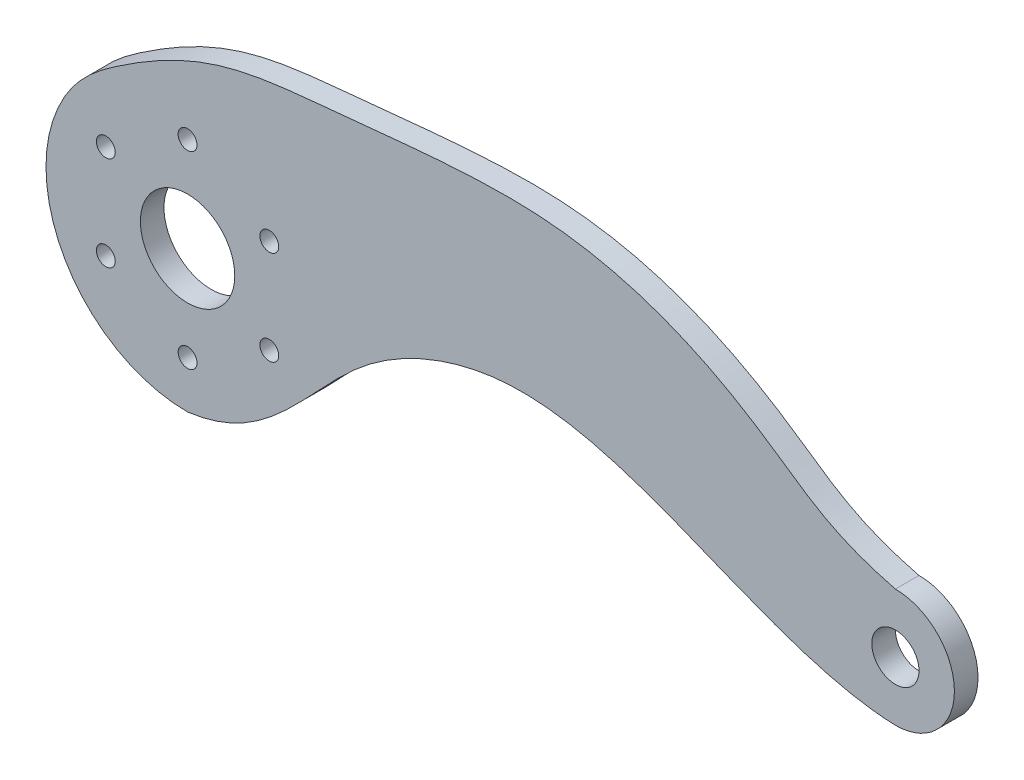
ISO-10303-21;
HEADER;
FILE_DESCRIPTION(('STEP AP214'),'2;1');
FILE_NAME('part.step','',(''),(''),'','','');
FILE_SCHEMA(('AUTOMOTIVE_DESIGN { 1 0 10303 214 1 1 1 1 }'));
ENDSEC;
DATA;
#1=APPLICATION_CONTEXT('core data for automotive mechanical design processes');
#2=APPLICATION_PROTOCOL_DEFINITION('international standard','automotive_design',2000,#1);
#3=PRODUCT_CONTEXT('',#1,'mechanical');
#4=PRODUCT('Part','Part','',(#3));
#5=PRODUCT_RELATED_PRODUCT_CATEGORY('part','',(#4));
#6=PRODUCT_DEFINITION_FORMATION('','',#4);
#7=PRODUCT_DEFINITION_CONTEXT('part definition',#1,'design');
#8=PRODUCT_DEFINITION('design','',#6,#7);
#9=PRODUCT_DEFINITION_SHAPE('','',#8);
#10=(LENGTH_UNIT() NAMED_UNIT(*) SI_UNIT(.MILLI.,.METRE.));
#11=(NAMED_UNIT(*) PLANE_ANGLE_UNIT() SI_UNIT($,.RADIAN.));
#12=(NAMED_UNIT(*) SI_UNIT($,.STERADIAN.) SOLID_ANGLE_UNIT());
#13=UNCERTAINTY_MEASURE_WITH_UNIT(LENGTH_MEASURE(1.E-05),#10,'distance_accuracy_value','');
#14=(GEOMETRIC_REPRESENTATION_CONTEXT(3) GLOBAL_UNCERTAINTY_ASSIGNED_CONTEXT((#13)) GLOBAL_UNIT_ASSIGNED_CONTEXT((#10,
#11,#12)) REPRESENTATION_CONTEXT('',''));
#15=CARTESIAN_POINT('',(0.,0.,0.));
#16=DIRECTION('',(0.,0.,1.));
#17=DIRECTION('',(1.,0.,0.));
#18=AXIS2_PLACEMENT_3D('',#15,#16,#17);
#19=CARTESIAN_POINT('',(150.,0.,5.));
#20=DIRECTION('',(0.,0.,-1.));
#21=DIRECTION('',(-1.,0.,0.));
#22=AXIS2_PLACEMENT_3D('',#19,#20,#21);
#23=CYLINDRICAL_SURFACE('',#22,12.5);
#24=CARTESIAN_POINT('',(150.,0.,0.));
#25=DIRECTION('',(0.,0.,1.));
#26=DIRECTION('',(1.,0.,0.));
#27=AXIS2_PLACEMENT_3D('',#24,#25,#26);
#28=CIRCLE('',#27,12.5);
#29=CARTESIAN_POINT('',(159.428456141883,-8.2069613609783,0.));
#30=VERTEX_POINT('',#29);
#31=CARTESIAN_POINT('',(150.,12.5,0.));
#32=VERTEX_POINT('',#31);
#33=EDGE_CURVE('E174',#30,#32,#28,.T.);
#34=ORIENTED_EDGE('',*,*,#33,.T.);
#35=DIRECTION('',(0.,0.,-1.));
#36=VECTOR('',#35,1.);
#37=CARTESIAN_POINT('',(150.,12.5,5.));
#38=LINE('',#37,#36);
#39=CARTESIAN_POINT('',(150.,12.5,5.));
#40=VERTEX_POINT('',#39);
#41=EDGE_CURVE('E11',#40,#32,#38,.T.);
#42=ORIENTED_EDGE('',*,*,#41,.F.);
#43=CARTESIAN_POINT('',(150.,0.,5.));
#44=DIRECTION('',(0.,0.,1.));
#45=DIRECTION('',(1.,0.,0.));
#46=AXIS2_PLACEMENT_3D('',#43,#44,#45);
#47=CIRCLE('',#46,12.5);
#48=CARTESIAN_POINT('',(159.428456141883,-8.2069613609783,5.));
#49=VERTEX_POINT('',#48);
#50=EDGE_CURVE('E90',#49,#40,#47,.T.);
#51=ORIENTED_EDGE('',*,*,#50,.F.);
#52=DIRECTION('',(0.,0.,-1.));
#53=VECTOR('',#52,1.);
#54=CARTESIAN_POINT('',(159.428456141883,-8.2069613609783,5.));
#55=LINE('',#54,#53);
#56=EDGE_CURVE('E155',#49,#30,#55,.T.);
#57=ORIENTED_EDGE('',*,*,#56,.T.);
#58=EDGE_LOOP('',(#34,#42,#51,#57));
#59=FACE_BOUND('',#58,.T.);
#60=ADVANCED_FACE('F39',(#59),#23,.T.);
#61=CARTESIAN_POINT('',(-26.0634616612886,14.8558394656963,5.));
#62=CARTESIAN_POINT('',(-22.9952074946197,20.2388624193786,5.));
#63=CARTESIAN_POINT('',(2.37328640151584,39.108047074936,5.));
#64=CARTESIAN_POINT('',(20.1597515349127,39.1077374338959,5.));
#65=CARTESIAN_POINT('',(86.7416157626449,46.9998153067509,5.));
#66=CARTESIAN_POINT('',(125.812924925436,25.830072721874,5.));
#67=CARTESIAN_POINT('',(135.882657692138,16.0754827587227,5.));
#68=CARTESIAN_POINT('',(150.,12.5,5.));
#69=B_SPLINE_CURVE_WITH_KNOTS('',3,(#61,#62,#63,#64,#65,#66,#67,#68),.UNSPECIFIED.,.F.,.F.,(4,1,
1,1,1,4),(0.,0.056043778506057,0.324796612619319,0.474987683898155,0.725167046493458,
0.945335070860267),.UNSPECIFIED.);
#70=DIRECTION('',(0.,0.,-1.));
#71=VECTOR('',#70,1.);
#72=SURFACE_OF_LINEAR_EXTRUSION('',#69,#71);
#73=CARTESIAN_POINT('',(-26.0634616612886,14.8558394656963,0.));
#74=CARTESIAN_POINT('',(-22.9952074946197,20.2388624193786,0.));
#75=CARTESIAN_POINT('',(2.37328640151584,39.108047074936,0.));
#76=CARTESIAN_POINT('',(20.1597515349127,39.1077374338959,0.));
#77=CARTESIAN_POINT('',(86.7416157626449,46.9998153067509,0.));
#78=CARTESIAN_POINT('',(125.812924925436,25.830072721874,0.));
#79=CARTESIAN_POINT('',(135.882657692138,16.0754827587227,0.));
#80=CARTESIAN_POINT('',(150.,12.5,0.));
#81=B_SPLINE_CURVE_WITH_KNOTS('',3,(#73,#74,#75,#76,#77,#78,#79,#80),.UNSPECIFIED.,.F.,.F.,(4,1,
1,1,1,4),(0.,0.056043778506057,0.324796612619319,0.474987683898155,0.725167046493458,
0.945335070860267),.UNSPECIFIED.);
#82=CARTESIAN_POINT('',(-26.0634616612886,14.8558394656963,0.));
#83=VERTEX_POINT('',#82);
#84=EDGE_CURVE('E170',#83,#32,#81,.T.);
#85=ORIENTED_EDGE('',*,*,#84,.F.);
#86=DIRECTION('',(0.,0.,-1.));
#87=VECTOR('',#86,1.);
#88=CARTESIAN_POINT('',(-26.0634616612886,14.8558394656963,5.));
#89=LINE('',#88,#87);
#90=CARTESIAN_POINT('',(-26.0634616612886,14.8558394656963,5.));
#91=VERTEX_POINT('',#90);
#92=EDGE_CURVE('E48',#91,#83,#89,.T.);
#93=ORIENTED_EDGE('',*,*,#92,.F.);
#94=EDGE_CURVE('E124',#91,#40,#69,.T.);
#95=ORIENTED_EDGE('',*,*,#94,.T.);
#96=ORIENTED_EDGE('',*,*,#41,.T.);
#97=EDGE_LOOP('',(#85,#93,#95,#96));
#98=FACE_BOUND('',#97,.T.);
#99=ADVANCED_FACE('F172',(#98),#72,.T.);
#100=CARTESIAN_POINT('',(0.,0.,5.));
#101=DIRECTION('',(0.,0.,-1.));
#102=DIRECTION('',(-1.,0.,0.));
#103=AXIS2_PLACEMENT_3D('',#100,#101,#102);
#104=CYLINDRICAL_SURFACE('',#103,30.);
#105=CARTESIAN_POINT('',(0.,0.,0.));
#106=DIRECTION('',(0.,0.,1.));
#107=DIRECTION('',(1.,0.,0.));
#108=AXIS2_PLACEMENT_3D('',#105,#106,#107);
#109=CIRCLE('',#108,30.);
#110=CARTESIAN_POINT('',(0.,-30.,0.));
#111=VERTEX_POINT('',#110);
#112=EDGE_CURVE('E162',#83,#111,#109,.T.);
#113=ORIENTED_EDGE('',*,*,#112,.T.);
#114=DIRECTION('',(0.,0.,-1.));
#115=VECTOR('',#114,1.);
#116=CARTESIAN_POINT('',(0.,-30.,5.));
#117=LINE('',#116,#115);
#118=CARTESIAN_POINT('',(0.,-30.,5.));
#119=VERTEX_POINT('',#118);
#120=EDGE_CURVE('E115',#119,#111,#117,.T.);
#121=ORIENTED_EDGE('',*,*,#120,.F.);
#122=CARTESIAN_POINT('',(0.,0.,5.));
#123=DIRECTION('',(0.,0.,1.));
#124=DIRECTION('',(1.,0.,0.));
#125=AXIS2_PLACEMENT_3D('',#122,#123,#124);
#126=CIRCLE('',#125,30.);
#127=EDGE_CURVE('E106',#91,#119,#126,.T.);
#128=ORIENTED_EDGE('',*,*,#127,.F.);
#129=ORIENTED_EDGE('',*,*,#92,.T.);
#130=EDGE_LOOP('',(#113,#121,#128,#129));
#131=FACE_BOUND('',#130,.T.);
#132=ADVANCED_FACE('F161',(#131),#104,.T.);
#133=CARTESIAN_POINT('',(0.,-30.,5.));
#134=CARTESIAN_POINT('',(17.9367533899456,-27.7458951634713,5.));
#135=CARTESIAN_POINT('',(30.1701670762407,-2.35203179127826,5.));
#136=CARTESIAN_POINT('',(85.2158700652859,19.6119948147056,5.));
#137=CARTESIAN_POINT('',(122.199362380188,-11.5342342503251,5.));
#138=CARTESIAN_POINT('',(150.,-12.5,5.));
#139=B_SPLINE_CURVE_WITH_KNOTS('',3,(#133,#134,#135,#136,#137,#138),.UNSPECIFIED.,.F.,.F.,(4,1,
1,4),(0.,0.288188907900472,0.475939829148129,1.),.UNSPECIFIED.);
#140=DIRECTION('',(0.,0.,-1.));
#141=VECTOR('',#140,1.);
#142=SURFACE_OF_LINEAR_EXTRUSION('',#139,#141);
#143=CARTESIAN_POINT('',(0.,-30.,0.));
#144=CARTESIAN_POINT('',(17.9367533899456,-27.7458951634713,0.));
#145=CARTESIAN_POINT('',(30.1701670762407,-2.35203179127826,0.));
#146=CARTESIAN_POINT('',(85.2158700652859,19.6119948147056,0.));
#147=CARTESIAN_POINT('',(122.199362380188,-11.5342342503251,0.));
#148=CARTESIAN_POINT('',(150.,-12.5,0.));
#149=B_SPLINE_CURVE_WITH_KNOTS('',3,(#143,#144,#145,#146,#147,#148),.UNSPECIFIED.,.F.,.F.,(4,1,
1,4),(0.,0.288188907900472,0.475939829148129,1.),.UNSPECIFIED.);
#150=CARTESIAN_POINT('',(150.,-12.5,0.));
#151=VERTEX_POINT('',#150);
#152=EDGE_CURVE('E114',#111,#151,#149,.T.);
#153=ORIENTED_EDGE('',*,*,#152,.T.);
#154=DIRECTION('',(0.,0.,-1.));
#155=VECTOR('',#154,1.);
#156=CARTESIAN_POINT('',(150.,-12.5,5.));
#157=LINE('',#156,#155);
#158=CARTESIAN_POINT('',(150.,-12.5,5.));
#159=VERTEX_POINT('',#158);
#160=EDGE_CURVE('E111',#159,#151,#157,.T.);
#161=ORIENTED_EDGE('',*,*,#160,.F.);
#162=EDGE_CURVE('E99',#119,#159,#139,.T.);
#163=ORIENTED_EDGE('',*,*,#162,.F.);
#164=ORIENTED_EDGE('',*,*,#120,.T.);
#165=EDGE_LOOP('',(#153,#161,#163,#164));
#166=FACE_BOUND('',#165,.T.);
#167=ADVANCED_FACE('F112',(#166),#142,.F.);
#168=CARTESIAN_POINT('',(157.604608426971,-9.92068196609678,0.));
#169=VERTEX_POINT('',#168);
#170=EDGE_CURVE('E78',#151,#169,#28,.T.);
#171=ORIENTED_EDGE('',*,*,#170,.T.);
#172=DIRECTION('',(0.,0.,-1.));
#173=VECTOR('',#172,1.);
#174=CARTESIAN_POINT('',(157.604608426971,-9.92068196609678,5.));
#175=LINE('',#174,#173);
#176=CARTESIAN_POINT('',(157.604608426971,-9.92068196609678,5.));
#177=VERTEX_POINT('',#176);
#178=EDGE_CURVE('E116',#177,#169,#175,.T.);
#179=ORIENTED_EDGE('',*,*,#178,.F.);
#180=EDGE_CURVE('E104',#159,#177,#47,.T.);
#181=ORIENTED_EDGE('',*,*,#180,.F.);
#182=ORIENTED_EDGE('',*,*,#160,.T.);
#183=EDGE_LOOP('',(#171,#179,#181,#182));
#184=FACE_BOUND('',#183,.T.);
#185=ADVANCED_FACE('F118',(#184),#23,.T.);
#186=CARTESIAN_POINT('',(150.,0.,5.));
#187=DIRECTION('',(0.,0.,-1.));
#188=DIRECTION('',(-1.,0.,0.));
#189=AXIS2_PLACEMENT_3D('',#186,#187,#188);
#190=CYLINDRICAL_SURFACE('',#189,4.99999999999999);
#191=CARTESIAN_POINT('',(150.,0.,5.));
#192=DIRECTION('',(0.,0.,1.));
#193=DIRECTION('',(1.,0.,0.));
#194=AXIS2_PLACEMENT_3D('',#191,#192,#193);
#195=CIRCLE('',#194,4.99999999999999);
#196=CARTESIAN_POINT('',(155.,0.,5.));
#197=VERTEX_POINT('',#196);
#198=EDGE_CURVE('E246',#197,#197,#195,.T.);
#199=ORIENTED_EDGE('',*,*,#198,.T.);
#200=EDGE_LOOP('',(#199));
#201=FACE_BOUND('',#200,.T.);
#202=CARTESIAN_POINT('',(150.,0.,0.));
#203=DIRECTION('',(0.,0.,1.));
#204=DIRECTION('',(1.,0.,0.));
#205=AXIS2_PLACEMENT_3D('',#202,#203,#204);
#206=CIRCLE('',#205,4.99999999999999);
#207=CARTESIAN_POINT('',(155.,0.,0.));
#208=VERTEX_POINT('',#207);
#209=EDGE_CURVE('E146',#208,#208,#206,.T.);
#210=ORIENTED_EDGE('',*,*,#209,.F.);
#211=EDGE_LOOP('',(#210));
#212=FACE_BOUND('',#211,.T.);
#213=ADVANCED_FACE('F203',(#201,#212),#190,.F.);
#214=CARTESIAN_POINT('',(-17.3205080756875,-10.0000000000007,5.));
#215=DIRECTION('',(0.,0.,-1.));
#216=DIRECTION('',(-1.,0.,0.));
#217=AXIS2_PLACEMENT_3D('',#214,#215,#216);
#218=CYLINDRICAL_SURFACE('',#217,2.);
#219=CARTESIAN_POINT('',(-17.3205080756875,-10.0000000000007,5.));
#220=DIRECTION('',(0.,0.,1.));
#221=DIRECTION('',(1.,0.,0.));
#222=AXIS2_PLACEMENT_3D('',#219,#220,#221);
#223=CIRCLE('',#222,2.);
#224=CARTESIAN_POINT('',(-15.3205080756875,-10.0000000000007,5.));
#225=VERTEX_POINT('',#224);
#226=EDGE_CURVE('E120',#225,#225,#223,.T.);
#227=ORIENTED_EDGE('',*,*,#226,.T.);
#228=EDGE_LOOP('',(#227));
#229=FACE_BOUND('',#228,.T.);
#230=CARTESIAN_POINT('',(-17.3205080756875,-10.0000000000007,0.));
#231=DIRECTION('',(0.,0.,1.));
#232=DIRECTION('',(1.,0.,0.));
#233=AXIS2_PLACEMENT_3D('',#230,#231,#232);
#234=CIRCLE('',#233,2.);
#235=CARTESIAN_POINT('',(-15.3205080756875,-10.0000000000007,0.));
#236=VERTEX_POINT('',#235);
#237=EDGE_CURVE('E151',#236,#236,#234,.T.);
#238=ORIENTED_EDGE('',*,*,#237,.F.);
#239=EDGE_LOOP('',(#238));
#240=FACE_BOUND('',#239,.T.);
#241=ADVANCED_FACE('F200',(#229,#240),#218,.F.);
#242=CARTESIAN_POINT('',(150.,-12.5,5.));
#243=CARTESIAN_POINT('',(154.881138688973,-13.047211763152,5.));
#244=CARTESIAN_POINT('',(159.428456141883,-8.20696136097829,5.));
#245=B_SPLINE_CURVE_WITH_KNOTS('',2,(#242,#243,#244),.UNSPECIFIED.,.F.,.F.,(3,3),
(0.955766329423218,1.),.UNSPECIFIED.);
#246=DIRECTION('',(0.,0.,-1.));
#247=VECTOR('',#246,1.);
#248=SURFACE_OF_LINEAR_EXTRUSION('',#245,#247);
#249=CARTESIAN_POINT('',(150.,-12.5,0.));
#250=CARTESIAN_POINT('',(154.881138688973,-13.047211763152,0.));
#251=CARTESIAN_POINT('',(159.428456141883,-8.20696136097829,0.));
#252=B_SPLINE_CURVE_WITH_KNOTS('',2,(#249,#250,#251),.UNSPECIFIED.,.F.,.F.,(3,3),
(0.955766329423218,1.),.UNSPECIFIED.);
#253=EDGE_CURVE('E84',#169,#30,#252,.T.);
#254=ORIENTED_EDGE('',*,*,#253,.T.);
#255=ORIENTED_EDGE('',*,*,#56,.F.);
#256=EDGE_CURVE('E56',#177,#49,#245,.T.);
#257=ORIENTED_EDGE('',*,*,#256,.F.);
#258=ORIENTED_EDGE('',*,*,#178,.T.);
#259=EDGE_LOOP('',(#254,#255,#257,#258));
#260=FACE_BOUND('',#259,.T.);
#261=ADVANCED_FACE('F202',(#260),#248,.F.);
#262=CARTESIAN_POINT('',(1.68815751063618E-12,-20.,5.));
#263=DIRECTION('',(0.,0.,-1.));
#264=DIRECTION('',(-1.,0.,0.));
#265=AXIS2_PLACEMENT_3D('',#262,#263,#264);
#266=CYLINDRICAL_SURFACE('',#265,2.);
#267=CARTESIAN_POINT('',(1.68815751063618E-12,-20.,5.));
#268=DIRECTION('',(0.,0.,1.));
#269=DIRECTION('',(1.,0.,0.));
#270=AXIS2_PLACEMENT_3D('',#267,#268,#269);
#271=CIRCLE('',#270,2.);
#272=CARTESIAN_POINT('',(2.00000000000169,-20.,5.));
#273=VERTEX_POINT('',#272);
#274=EDGE_CURVE('E125',#273,#273,#271,.T.);
#275=ORIENTED_EDGE('',*,*,#274,.T.);
#276=EDGE_LOOP('',(#275));
#277=FACE_BOUND('',#276,.T.);
#278=CARTESIAN_POINT('',(1.68815751063618E-12,-20.,0.));
#279=DIRECTION('',(0.,0.,1.));
#280=DIRECTION('',(1.,0.,0.));
#281=AXIS2_PLACEMENT_3D('',#278,#279,#280);
#282=CIRCLE('',#281,2.);
#283=CARTESIAN_POINT('',(2.00000000000169,-20.,0.));
#284=VERTEX_POINT('',#283);
#285=EDGE_CURVE('E176',#284,#284,#282,.T.);
#286=ORIENTED_EDGE('',*,*,#285,.F.);
#287=EDGE_LOOP('',(#286));
#288=FACE_BOUND('',#287,.T.);
#289=ADVANCED_FACE('F210',(#277,#288),#266,.F.);
#290=CARTESIAN_POINT('',(17.32050807569,-9.99999999999927,5.));
#291=DIRECTION('',(0.,0.,-1.));
#292=DIRECTION('',(-1.,0.,0.));
#293=AXIS2_PLACEMENT_3D('',#290,#291,#292);
#294=CYLINDRICAL_SURFACE('',#293,2.);
#295=CARTESIAN_POINT('',(17.32050807569,-9.99999999999927,5.));
#296=DIRECTION('',(0.,0.,1.));
#297=DIRECTION('',(1.,0.,0.));
#298=AXIS2_PLACEMENT_3D('',#295,#296,#297);
#299=CIRCLE('',#298,2.);
#300=CARTESIAN_POINT('',(19.32050807569,-9.99999999999927,5.));
#301=VERTEX_POINT('',#300);
#302=EDGE_CURVE('E128',#301,#301,#299,.T.);
#303=ORIENTED_EDGE('',*,*,#302,.T.);
#304=EDGE_LOOP('',(#303));
#305=FACE_BOUND('',#304,.T.);
#306=CARTESIAN_POINT('',(17.32050807569,-9.99999999999927,0.));
#307=DIRECTION('',(0.,0.,1.));
#308=DIRECTION('',(1.,0.,0.));
#309=AXIS2_PLACEMENT_3D('',#306,#307,#308);
#310=CIRCLE('',#309,2.);
#311=CARTESIAN_POINT('',(19.32050807569,-9.99999999999927,0.));
#312=VERTEX_POINT('',#311);
#313=EDGE_CURVE('E260',#312,#312,#310,.T.);
#314=ORIENTED_EDGE('',*,*,#313,.F.);
#315=EDGE_LOOP('',(#314));
#316=FACE_BOUND('',#315,.T.);
#317=ADVANCED_FACE('F267',(#305,#316),#294,.F.);
#318=CARTESIAN_POINT('',(17.3205080756892,10.0000000000007,5.));
#319=DIRECTION('',(0.,0.,-1.));
#320=DIRECTION('',(-1.,0.,0.));
#321=AXIS2_PLACEMENT_3D('',#318,#319,#320);
#322=CYLINDRICAL_SURFACE('',#321,2.00000000000001);
#323=CARTESIAN_POINT('',(17.3205080756892,10.0000000000007,5.));
#324=DIRECTION('',(0.,0.,1.));
#325=DIRECTION('',(1.,0.,0.));
#326=AXIS2_PLACEMENT_3D('',#323,#324,#325);
#327=CIRCLE('',#326,2.00000000000001);
#328=CARTESIAN_POINT('',(19.3205080756892,10.0000000000007,5.));
#329=VERTEX_POINT('',#328);
#330=EDGE_CURVE('E132',#329,#329,#327,.T.);
#331=ORIENTED_EDGE('',*,*,#330,.T.);
#332=EDGE_LOOP('',(#331));
#333=FACE_BOUND('',#332,.T.);
#334=CARTESIAN_POINT('',(17.3205080756892,10.0000000000007,0.));
#335=DIRECTION('',(0.,0.,1.));
#336=DIRECTION('',(1.,0.,0.));
#337=AXIS2_PLACEMENT_3D('',#334,#335,#336);
#338=CIRCLE('',#337,2.00000000000001);
#339=CARTESIAN_POINT('',(19.3205080756892,10.0000000000007,0.));
#340=VERTEX_POINT('',#339);
#341=EDGE_CURVE('E257',#340,#340,#338,.T.);
#342=ORIENTED_EDGE('',*,*,#341,.F.);
#343=EDGE_LOOP('',(#342));
#344=FACE_BOUND('',#343,.T.);
#345=ADVANCED_FACE('F272',(#333,#344),#322,.F.);
#346=CARTESIAN_POINT('',(0.,20.,5.));
#347=DIRECTION('',(0.,0.,-1.));
#348=DIRECTION('',(-1.,0.,0.));
#349=AXIS2_PLACEMENT_3D('',#346,#347,#348);
#350=CYLINDRICAL_SURFACE('',#349,2.);
#351=CARTESIAN_POINT('',(0.,20.,5.));
#352=DIRECTION('',(0.,0.,1.));
#353=DIRECTION('',(1.,0.,0.));
#354=AXIS2_PLACEMENT_3D('',#351,#352,#353);
#355=CIRCLE('',#354,2.);
#356=CARTESIAN_POINT('',(2.,20.,5.));
#357=VERTEX_POINT('',#356);
#358=EDGE_CURVE('E137',#357,#357,#355,.T.);
#359=ORIENTED_EDGE('',*,*,#358,.T.);
#360=EDGE_LOOP('',(#359));
#361=FACE_BOUND('',#360,.T.);
#362=CARTESIAN_POINT('',(0.,20.,0.));
#363=DIRECTION('',(0.,0.,1.));
#364=DIRECTION('',(1.,0.,0.));
#365=AXIS2_PLACEMENT_3D('',#362,#363,#364);
#366=CIRCLE('',#365,2.);
#367=CARTESIAN_POINT('',(2.,20.,0.));
#368=VERTEX_POINT('',#367);
#369=EDGE_CURVE('E254',#368,#368,#366,.T.);
#370=ORIENTED_EDGE('',*,*,#369,.F.);
#371=EDGE_LOOP('',(#370));
#372=FACE_BOUND('',#371,.T.);
#373=ADVANCED_FACE('F277',(#361,#372),#350,.F.);
#374=CARTESIAN_POINT('',(-17.3205080756884,9.99999999999926,5.));
#375=DIRECTION('',(0.,0.,-1.));
#376=DIRECTION('',(-1.,0.,0.));
#377=AXIS2_PLACEMENT_3D('',#374,#375,#376);
#378=CYLINDRICAL_SURFACE('',#377,2.);
#379=CARTESIAN_POINT('',(-17.3205080756884,9.99999999999926,5.));
#380=DIRECTION('',(0.,0.,1.));
#381=DIRECTION('',(1.,0.,0.));
#382=AXIS2_PLACEMENT_3D('',#379,#380,#381);
#383=CIRCLE('',#382,2.);
#384=CARTESIAN_POINT('',(-15.3205080756884,9.99999999999926,5.));
#385=VERTEX_POINT('',#384);
#386=EDGE_CURVE('E140',#385,#385,#383,.T.);
#387=ORIENTED_EDGE('',*,*,#386,.T.);
#388=EDGE_LOOP('',(#387));
#389=FACE_BOUND('',#388,.T.);
#390=CARTESIAN_POINT('',(-17.3205080756884,9.99999999999926,0.));
#391=DIRECTION('',(0.,0.,1.));
#392=DIRECTION('',(1.,0.,0.));
#393=AXIS2_PLACEMENT_3D('',#390,#391,#392);
#394=CIRCLE('',#393,2.);
#395=CARTESIAN_POINT('',(-15.3205080756884,9.99999999999926,0.));
#396=VERTEX_POINT('',#395);
#397=EDGE_CURVE('E251',#396,#396,#394,.T.);
#398=ORIENTED_EDGE('',*,*,#397,.F.);
#399=EDGE_LOOP('',(#398));
#400=FACE_BOUND('',#399,.T.);
#401=ADVANCED_FACE('F41',(#389,#400),#378,.F.);
#402=CARTESIAN_POINT('',(0.,0.,5.));
#403=DIRECTION('',(0.,0.,-1.));
#404=DIRECTION('',(-1.,0.,0.));
#405=AXIS2_PLACEMENT_3D('',#402,#403,#404);
#406=CYLINDRICAL_SURFACE('',#405,10.);
#407=CARTESIAN_POINT('',(0.,0.,5.));
#408=DIRECTION('',(0.,0.,1.));
#409=DIRECTION('',(1.,0.,0.));
#410=AXIS2_PLACEMENT_3D('',#407,#408,#409);
#411=CIRCLE('',#410,10.);
#412=CARTESIAN_POINT('',(10.,0.,5.));
#413=VERTEX_POINT('',#412);
#414=EDGE_CURVE('E157',#413,#413,#411,.T.);
#415=ORIENTED_EDGE('',*,*,#414,.T.);
#416=EDGE_LOOP('',(#415));
#417=FACE_BOUND('',#416,.T.);
#418=CARTESIAN_POINT('',(0.,0.,0.));
#419=DIRECTION('',(0.,0.,1.));
#420=DIRECTION('',(1.,0.,0.));
#421=AXIS2_PLACEMENT_3D('',#418,#419,#420);
#422=CIRCLE('',#421,10.);
#423=CARTESIAN_POINT('',(10.,0.,0.));
#424=VERTEX_POINT('',#423);
#425=EDGE_CURVE('E142',#424,#424,#422,.T.);
#426=ORIENTED_EDGE('',*,*,#425,.F.);
#427=EDGE_LOOP('',(#426));
#428=FACE_BOUND('',#427,.T.);
#429=ADVANCED_FACE('F284',(#417,#428),#406,.F.);
#430=CARTESIAN_POINT('',(0.,0.,5.));
#431=DIRECTION('',(0.,0.,1.));
#432=DIRECTION('',(1.,0.,0.));
#433=AXIS2_PLACEMENT_3D('',#430,#431,#432);
#434=PLANE('',#433);
#435=ORIENTED_EDGE('',*,*,#386,.F.);
#436=EDGE_LOOP('',(#435));
#437=FACE_BOUND('',#436,.T.);
#438=ORIENTED_EDGE('',*,*,#358,.F.);
#439=EDGE_LOOP('',(#438));
#440=FACE_BOUND('',#439,.T.);
#441=ORIENTED_EDGE('',*,*,#330,.F.);
#442=EDGE_LOOP('',(#441));
#443=FACE_BOUND('',#442,.T.);
#444=ORIENTED_EDGE('',*,*,#302,.F.);
#445=EDGE_LOOP('',(#444));
#446=FACE_BOUND('',#445,.T.);
#447=ORIENTED_EDGE('',*,*,#274,.F.);
#448=EDGE_LOOP('',(#447));
#449=FACE_BOUND('',#448,.T.);
#450=ORIENTED_EDGE('',*,*,#50,.T.);
#451=ORIENTED_EDGE('',*,*,#94,.F.);
#452=ORIENTED_EDGE('',*,*,#127,.T.);
#453=ORIENTED_EDGE('',*,*,#162,.T.);
#454=ORIENTED_EDGE('',*,*,#180,.T.);
#455=ORIENTED_EDGE('',*,*,#256,.T.);
#456=EDGE_LOOP('',(#450,#451,#452,#453,#454,#455));
#457=FACE_BOUND('',#456,.T.);
#458=ORIENTED_EDGE('',*,*,#226,.F.);
#459=EDGE_LOOP('',(#458));
#460=FACE_BOUND('',#459,.T.);
#461=ORIENTED_EDGE('',*,*,#198,.F.);
#462=EDGE_LOOP('',(#461));
#463=FACE_BOUND('',#462,.T.);
#464=ORIENTED_EDGE('',*,*,#414,.F.);
#465=EDGE_LOOP('',(#464));
#466=FACE_BOUND('',#465,.T.);
#467=ADVANCED_FACE('F101',(#437,#440,#443,#446,#449,#457,#460,#463,#466),#434,.T.);
#468=CARTESIAN_POINT('',(0.,0.,0.));
#469=DIRECTION('',(0.,0.,1.));
#470=DIRECTION('',(1.,0.,0.));
#471=AXIS2_PLACEMENT_3D('',#468,#469,#470);
#472=PLANE('',#471);
#473=ORIENTED_EDGE('',*,*,#397,.T.);
#474=EDGE_LOOP('',(#473));
#475=FACE_BOUND('',#474,.T.);
#476=ORIENTED_EDGE('',*,*,#369,.T.);
#477=EDGE_LOOP('',(#476));
#478=FACE_BOUND('',#477,.T.);
#479=ORIENTED_EDGE('',*,*,#341,.T.);
#480=EDGE_LOOP('',(#479));
#481=FACE_BOUND('',#480,.T.);
#482=ORIENTED_EDGE('',*,*,#313,.T.);
#483=EDGE_LOOP('',(#482));
#484=FACE_BOUND('',#483,.T.);
#485=ORIENTED_EDGE('',*,*,#285,.T.);
#486=EDGE_LOOP('',(#485));
#487=FACE_BOUND('',#486,.T.);
#488=ORIENTED_EDGE('',*,*,#33,.F.);
#489=ORIENTED_EDGE('',*,*,#253,.F.);
#490=ORIENTED_EDGE('',*,*,#170,.F.);
#491=ORIENTED_EDGE('',*,*,#152,.F.);
#492=ORIENTED_EDGE('',*,*,#112,.F.);
#493=ORIENTED_EDGE('',*,*,#84,.T.);
#494=EDGE_LOOP('',(#488,#489,#490,#491,#492,#493));
#495=FACE_BOUND('',#494,.T.);
#496=ORIENTED_EDGE('',*,*,#237,.T.);
#497=EDGE_LOOP('',(#496));
#498=FACE_BOUND('',#497,.T.);
#499=ORIENTED_EDGE('',*,*,#209,.T.);
#500=EDGE_LOOP('',(#499));
#501=FACE_BOUND('',#500,.T.);
#502=ORIENTED_EDGE('',*,*,#425,.T.);
#503=EDGE_LOOP('',(#502));
#504=FACE_BOUND('',#503,.T.);
#505=ADVANCED_FACE('F168',(#475,#478,#481,#484,#487,#495,#498,#501,#504),#472,.F.);
#506=CLOSED_SHELL('',(#60,#99,#132,#167,#185,#213,#241,#261,#289,#317,#345,#373,#401,#429,#467,#505));
#507=MANIFOLD_SOLID_BREP('B2',#506);
#508=ADVANCED_BREP_SHAPE_REPRESENTATION('',(#18,#507),#14);
#509=SHAPE_DEFINITION_REPRESENTATION(#9,#508);
ENDSEC;
END-ISO-10303-21;
